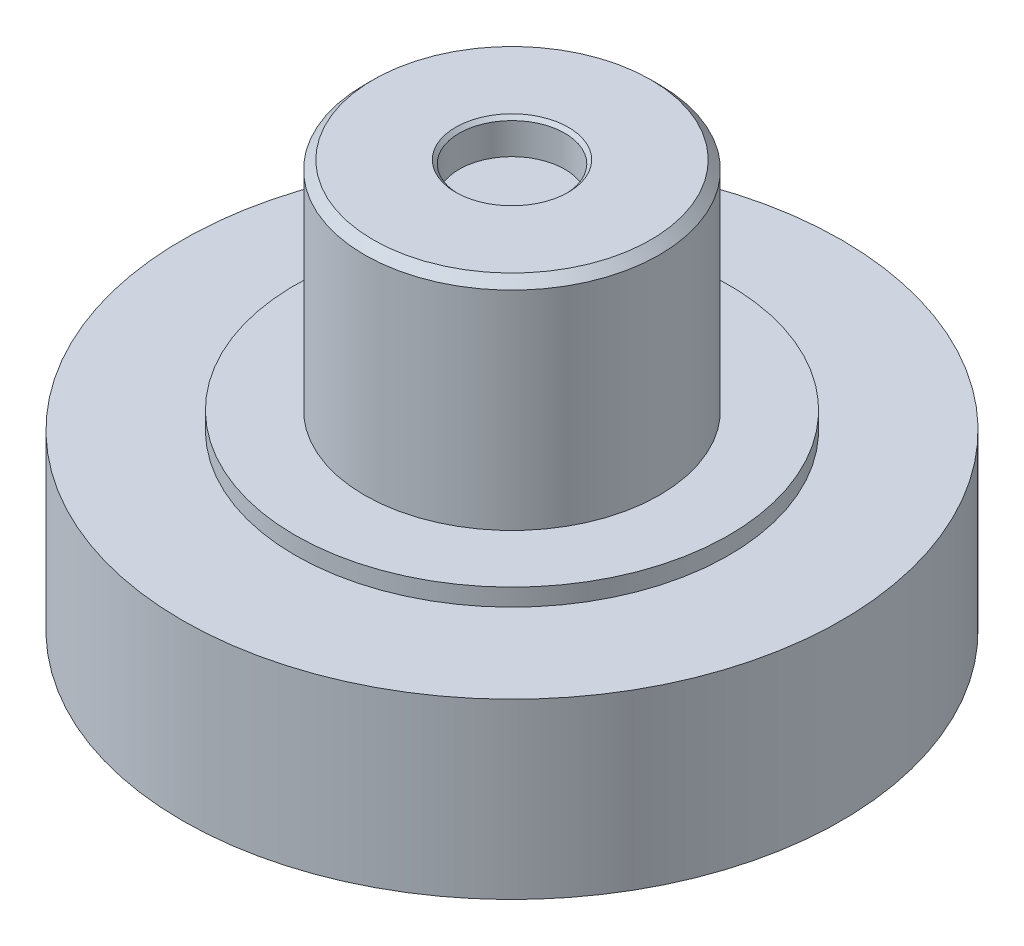
ISO-10303-21;
HEADER;
FILE_DESCRIPTION(('STEP AP214'),'2;1');
FILE_NAME('part.step','',(''),(''),'','','');
FILE_SCHEMA(('AUTOMOTIVE_DESIGN { 1 0 10303 214 1 1 1 1 }'));
ENDSEC;
DATA;
#1=APPLICATION_CONTEXT('core data for automotive mechanical design processes');
#2=APPLICATION_PROTOCOL_DEFINITION('international standard','automotive_design',2000,#1);
#3=PRODUCT_CONTEXT('',#1,'mechanical');
#4=PRODUCT('Part','Part','',(#3));
#5=PRODUCT_RELATED_PRODUCT_CATEGORY('part','',(#4));
#6=PRODUCT_DEFINITION_FORMATION('','',#4);
#7=PRODUCT_DEFINITION_CONTEXT('part definition',#1,'design');
#8=PRODUCT_DEFINITION('design','',#6,#7);
#9=PRODUCT_DEFINITION_SHAPE('','',#8);
#10=(LENGTH_UNIT() NAMED_UNIT(*) SI_UNIT(.MILLI.,.METRE.));
#11=(NAMED_UNIT(*) PLANE_ANGLE_UNIT() SI_UNIT($,.RADIAN.));
#12=(NAMED_UNIT(*) SI_UNIT($,.STERADIAN.) SOLID_ANGLE_UNIT());
#13=UNCERTAINTY_MEASURE_WITH_UNIT(LENGTH_MEASURE(1.E-05),#10,'distance_accuracy_value','');
#14=(GEOMETRIC_REPRESENTATION_CONTEXT(3) GLOBAL_UNCERTAINTY_ASSIGNED_CONTEXT((#13)) GLOBAL_UNIT_ASSIGNED_CONTEXT((#10,
#11,#12)) REPRESENTATION_CONTEXT('',''));
#15=CARTESIAN_POINT('',(0.,0.,0.));
#16=DIRECTION('',(0.,0.,1.));
#17=DIRECTION('',(1.,0.,0.));
#18=AXIS2_PLACEMENT_3D('',#15,#16,#17);
#19=CARTESIAN_POINT('',(0.,10.,0.));
#20=DIRECTION('',(0.,-1.,0.));
#21=DIRECTION('',(0.,0.,-1.));
#22=AXIS2_PLACEMENT_3D('',#19,#20,#21);
#23=CYLINDRICAL_SURFACE('',#22,19.);
#24=CARTESIAN_POINT('',(0.,10.,0.));
#25=DIRECTION('',(0.,1.,0.));
#26=DIRECTION('',(0.,0.,1.));
#27=AXIS2_PLACEMENT_3D('',#24,#25,#26);
#28=CIRCLE('',#27,19.);
#29=CARTESIAN_POINT('',(0.,10.,19.));
#30=VERTEX_POINT('',#29);
#31=EDGE_CURVE('E72',#30,#30,#28,.T.);
#32=ORIENTED_EDGE('',*,*,#31,.F.);
#33=EDGE_LOOP('',(#32));
#34=FACE_BOUND('',#33,.T.);
#35=CARTESIAN_POINT('',(0.,0.,0.));
#36=DIRECTION('',(0.,1.,0.));
#37=DIRECTION('',(0.,0.,1.));
#38=AXIS2_PLACEMENT_3D('',#35,#36,#37);
#39=CIRCLE('',#38,19.);
#40=CARTESIAN_POINT('',(0.,0.,19.));
#41=VERTEX_POINT('',#40);
#42=EDGE_CURVE('E69',#41,#41,#39,.T.);
#43=ORIENTED_EDGE('',*,*,#42,.T.);
#44=EDGE_LOOP('',(#43));
#45=FACE_BOUND('',#44,.T.);
#46=ADVANCED_FACE('F35',(#34,#45),#23,.T.);
#47=CARTESIAN_POINT('',(0.,10.,0.));
#48=DIRECTION('',(0.,1.,0.));
#49=DIRECTION('',(0.,0.,1.));
#50=AXIS2_PLACEMENT_3D('',#47,#48,#49);
#51=PLANE('',#50);
#52=CARTESIAN_POINT('',(0.,10.,0.));
#53=DIRECTION('',(0.,1.,0.));
#54=DIRECTION('',(0.,0.,1.));
#55=AXIS2_PLACEMENT_3D('',#52,#53,#54);
#56=CIRCLE('',#55,12.5);
#57=CARTESIAN_POINT('',(0.,10.,12.5));
#58=VERTEX_POINT('',#57);
#59=EDGE_CURVE('E76',#58,#58,#56,.T.);
#60=ORIENTED_EDGE('',*,*,#59,.F.);
#61=EDGE_LOOP('',(#60));
#62=FACE_BOUND('',#61,.T.);
#63=ORIENTED_EDGE('',*,*,#31,.T.);
#64=EDGE_LOOP('',(#63));
#65=FACE_BOUND('',#64,.T.);
#66=ADVANCED_FACE('F102',(#62,#65),#51,.T.);
#67=CARTESIAN_POINT('',(0.,0.,0.));
#68=DIRECTION('',(0.,1.,0.));
#69=DIRECTION('',(0.,0.,1.));
#70=AXIS2_PLACEMENT_3D('',#67,#68,#69);
#71=PLANE('',#70);
#72=CARTESIAN_POINT('',(0.,0.,11.5));
#73=DIRECTION('',(0.,1.,0.));
#74=DIRECTION('',(0.,0.,1.));
#75=AXIS2_PLACEMENT_3D('',#72,#73,#74);
#76=CIRCLE('',#75,5.58137084989848);
#77=CARTESIAN_POINT('',(0.,0.,17.0813708498985));
#78=VERTEX_POINT('',#77);
#79=EDGE_CURVE('E59',#78,#78,#76,.T.);
#80=ORIENTED_EDGE('',*,*,#79,.T.);
#81=EDGE_LOOP('',(#80));
#82=FACE_BOUND('',#81,.T.);
#83=ORIENTED_EDGE('',*,*,#42,.F.);
#84=EDGE_LOOP('',(#83));
#85=FACE_BOUND('',#84,.T.);
#86=ADVANCED_FACE('F108',(#82,#85),#71,.F.);
#87=CARTESIAN_POINT('',(0.,11.,0.));
#88=DIRECTION('',(0.,-1.,0.));
#89=DIRECTION('',(0.,0.,-1.));
#90=AXIS2_PLACEMENT_3D('',#87,#88,#89);
#91=CYLINDRICAL_SURFACE('',#90,12.5);
#92=CARTESIAN_POINT('',(0.,11.,0.));
#93=DIRECTION('',(0.,1.,0.));
#94=DIRECTION('',(0.,0.,1.));
#95=AXIS2_PLACEMENT_3D('',#92,#93,#94);
#96=CIRCLE('',#95,12.5);
#97=CARTESIAN_POINT('',(0.,11.,12.5));
#98=VERTEX_POINT('',#97);
#99=EDGE_CURVE('E73',#98,#98,#96,.T.);
#100=ORIENTED_EDGE('',*,*,#99,.F.);
#101=EDGE_LOOP('',(#100));
#102=FACE_BOUND('',#101,.T.);
#103=ORIENTED_EDGE('',*,*,#59,.T.);
#104=EDGE_LOOP('',(#103));
#105=FACE_BOUND('',#104,.T.);
#106=ADVANCED_FACE('F146',(#102,#105),#91,.T.);
#107=CARTESIAN_POINT('',(0.,11.,0.));
#108=DIRECTION('',(0.,1.,0.));
#109=DIRECTION('',(0.,0.,1.));
#110=AXIS2_PLACEMENT_3D('',#107,#108,#109);
#111=PLANE('',#110);
#112=CARTESIAN_POINT('',(0.,11.,0.));
#113=DIRECTION('',(0.,1.,0.));
#114=DIRECTION('',(0.,0.,1.));
#115=AXIS2_PLACEMENT_3D('',#112,#113,#114);
#116=CIRCLE('',#115,8.5);
#117=CARTESIAN_POINT('',(0.,11.,8.5));
#118=VERTEX_POINT('',#117);
#119=EDGE_CURVE('E68',#118,#118,#116,.T.);
#120=ORIENTED_EDGE('',*,*,#119,.F.);
#121=EDGE_LOOP('',(#120));
#122=FACE_BOUND('',#121,.T.);
#123=ORIENTED_EDGE('',*,*,#99,.T.);
#124=EDGE_LOOP('',(#123));
#125=FACE_BOUND('',#124,.T.);
#126=ADVANCED_FACE('F140',(#122,#125),#111,.T.);
#127=CARTESIAN_POINT('',(0.,23.5,0.));
#128=DIRECTION('',(0.,-1.,0.));
#129=DIRECTION('',(0.,0.,-1.));
#130=AXIS2_PLACEMENT_3D('',#127,#128,#129);
#131=CYLINDRICAL_SURFACE('',#130,8.5);
#132=CARTESIAN_POINT('',(0.,23.,0.));
#133=DIRECTION('',(0.,1.,0.));
#134=DIRECTION('',(0.,0.,1.));
#135=AXIS2_PLACEMENT_3D('',#132,#133,#134);
#136=CIRCLE('',#135,8.5);
#137=CARTESIAN_POINT('',(0.,23.,8.5));
#138=VERTEX_POINT('',#137);
#139=EDGE_CURVE('E47',#138,#138,#136,.F.);
#140=ORIENTED_EDGE('',*,*,#139,.T.);
#141=EDGE_LOOP('',(#140));
#142=FACE_BOUND('',#141,.T.);
#143=ORIENTED_EDGE('',*,*,#119,.T.);
#144=EDGE_LOOP('',(#143));
#145=FACE_BOUND('',#144,.T.);
#146=ADVANCED_FACE('F99',(#142,#145),#131,.T.);
#147=CARTESIAN_POINT('',(0.,23.5,0.));
#148=DIRECTION('',(0.,1.,0.));
#149=DIRECTION('',(0.,0.,1.));
#150=AXIS2_PLACEMENT_3D('',#147,#148,#149);
#151=PLANE('',#150);
#152=CARTESIAN_POINT('',(0.,23.5,0.));
#153=DIRECTION('',(0.,1.,0.));
#154=DIRECTION('',(0.,0.,1.));
#155=AXIS2_PLACEMENT_3D('',#152,#153,#154);
#156=CIRCLE('',#155,3.25);
#157=CARTESIAN_POINT('',(0.,23.5,3.25));
#158=VERTEX_POINT('',#157);
#159=EDGE_CURVE('E10',#158,#158,#156,.F.);
#160=ORIENTED_EDGE('',*,*,#159,.T.);
#161=EDGE_LOOP('',(#160));
#162=FACE_BOUND('',#161,.T.);
#163=CARTESIAN_POINT('',(0.,23.5,0.));
#164=DIRECTION('',(0.,1.,0.));
#165=DIRECTION('',(0.,0.,1.));
#166=AXIS2_PLACEMENT_3D('',#163,#164,#165);
#167=CIRCLE('',#166,8.00000000000001);
#168=CARTESIAN_POINT('',(0.,23.5,8.00000000000001));
#169=VERTEX_POINT('',#168);
#170=EDGE_CURVE('E51',#169,#169,#167,.T.);
#171=ORIENTED_EDGE('',*,*,#170,.T.);
#172=EDGE_LOOP('',(#171));
#173=FACE_BOUND('',#172,.T.);
#174=ADVANCED_FACE('F91',(#162,#173),#151,.T.);
#175=CARTESIAN_POINT('',(0.,21.5,0.));
#176=DIRECTION('',(0.,1.,0.));
#177=DIRECTION('',(0.,0.,1.));
#178=AXIS2_PLACEMENT_3D('',#175,#176,#177);
#179=CYLINDRICAL_SURFACE('',#178,3.05);
#180=CARTESIAN_POINT('',(0.,23.3,0.));
#181=DIRECTION('',(0.,1.,0.));
#182=DIRECTION('',(0.,0.,1.));
#183=AXIS2_PLACEMENT_3D('',#180,#181,#182);
#184=CIRCLE('',#183,3.05);
#185=CARTESIAN_POINT('',(0.,23.3,3.05));
#186=VERTEX_POINT('',#185);
#187=EDGE_CURVE('E43',#186,#186,#184,.T.);
#188=ORIENTED_EDGE('',*,*,#187,.T.);
#189=EDGE_LOOP('',(#188));
#190=FACE_BOUND('',#189,.T.);
#191=CARTESIAN_POINT('',(0.,21.5,0.));
#192=DIRECTION('',(0.,1.,0.));
#193=DIRECTION('',(0.,0.,1.));
#194=AXIS2_PLACEMENT_3D('',#191,#192,#193);
#195=CIRCLE('',#194,3.05);
#196=CARTESIAN_POINT('',(0.,21.5,3.05));
#197=VERTEX_POINT('',#196);
#198=EDGE_CURVE('E81',#197,#197,#195,.T.);
#199=ORIENTED_EDGE('',*,*,#198,.F.);
#200=EDGE_LOOP('',(#199));
#201=FACE_BOUND('',#200,.T.);
#202=ADVANCED_FACE('F89',(#190,#201),#179,.F.);
#203=CARTESIAN_POINT('',(0.,21.5,0.));
#204=DIRECTION('',(0.,1.,0.));
#205=DIRECTION('',(0.,0.,1.));
#206=AXIS2_PLACEMENT_3D('',#203,#204,#205);
#207=PLANE('',#206);
#208=ORIENTED_EDGE('',*,*,#198,.T.);
#209=EDGE_LOOP('',(#208));
#210=FACE_BOUND('',#209,.T.);
#211=ADVANCED_FACE('F87',(#210),#207,.T.);
#212=CARTESIAN_POINT('',(0.,0.,11.5));
#213=DIRECTION('',(0.,-1.,0.));
#214=DIRECTION('',(0.,0.,-1.));
#215=AXIS2_PLACEMENT_3D('',#212,#213,#214);
#216=CONICAL_SURFACE('',#215,5.25,0.78539816339745);
#217=CARTESIAN_POINT('',(0.,0.23431457505076,11.5));
#218=DIRECTION('',(0.,1.,0.));
#219=DIRECTION('',(0.,0.,1.));
#220=AXIS2_PLACEMENT_3D('',#217,#218,#219);
#221=CIRCLE('',#220,5.01568542494924);
#222=CARTESIAN_POINT('',(0.,0.23431457505076,16.5156854249492));
#223=VERTEX_POINT('',#222);
#224=EDGE_CURVE('E62',#223,#223,#221,.F.);
#225=ORIENTED_EDGE('',*,*,#224,.T.);
#226=EDGE_LOOP('',(#225));
#227=FACE_BOUND('',#226,.T.);
#228=CARTESIAN_POINT('',(0.,0.265685424949238,11.5));
#229=DIRECTION('',(0.,1.,0.));
#230=DIRECTION('',(0.,0.,1.));
#231=AXIS2_PLACEMENT_3D('',#228,#229,#230);
#232=CIRCLE('',#231,4.98431457505076);
#233=CARTESIAN_POINT('',(0.,0.265685424949238,16.4843145750508));
#234=VERTEX_POINT('',#233);
#235=EDGE_CURVE('E65',#234,#234,#232,.T.);
#236=ORIENTED_EDGE('',*,*,#235,.T.);
#237=EDGE_LOOP('',(#236));
#238=FACE_BOUND('',#237,.T.);
#239=ADVANCED_FACE('F97',(#227,#238),#216,.F.);
#240=CARTESIAN_POINT('',(0.,0.5,11.5));
#241=DIRECTION('',(0.,-1.,0.));
#242=DIRECTION('',(0.,0.,-1.));
#243=AXIS2_PLACEMENT_3D('',#240,#241,#242);
#244=PLANE('',#243);
#245=CARTESIAN_POINT('',(0.,0.5,11.5));
#246=DIRECTION('',(0.,-1.,0.));
#247=DIRECTION('',(0.,0.,-1.));
#248=AXIS2_PLACEMENT_3D('',#245,#246,#247);
#249=CIRCLE('',#248,4.41862915010152);
#250=CARTESIAN_POINT('',(0.,0.5,7.08137084989848));
#251=VERTEX_POINT('',#250);
#252=EDGE_CURVE('E56',#251,#251,#249,.T.);
#253=ORIENTED_EDGE('',*,*,#252,.T.);
#254=EDGE_LOOP('',(#253));
#255=FACE_BOUND('',#254,.T.);
#256=ADVANCED_FACE('F119',(#255),#244,.T.);
#257=CARTESIAN_POINT('',(0.,0.8,11.5));
#258=DIRECTION('',(0.,1.,0.));
#259=DIRECTION('',(0.,0.,1.));
#260=AXIS2_PLACEMENT_3D('',#257,#258,#259);
#261=TOROIDAL_SURFACE('',#260,5.58137084989848,0.8);
#262=ORIENTED_EDGE('',*,*,#79,.F.);
#263=EDGE_LOOP('',(#262));
#264=FACE_BOUND('',#263,.T.);
#265=ORIENTED_EDGE('',*,*,#224,.F.);
#266=EDGE_LOOP('',(#265));
#267=FACE_BOUND('',#266,.T.);
#268=ADVANCED_FACE('F115',(#264,#267),#261,.T.);
#269=CARTESIAN_POINT('',(0.,-0.3,11.5));
#270=DIRECTION('',(0.,-1.,0.));
#271=DIRECTION('',(0.,0.,-1.));
#272=AXIS2_PLACEMENT_3D('',#269,#270,#271);
#273=TOROIDAL_SURFACE('',#272,4.41862915010152,0.8);
#274=ORIENTED_EDGE('',*,*,#235,.F.);
#275=EDGE_LOOP('',(#274));
#276=FACE_BOUND('',#275,.T.);
#277=ORIENTED_EDGE('',*,*,#252,.F.);
#278=EDGE_LOOP('',(#277));
#279=FACE_BOUND('',#278,.T.);
#280=ADVANCED_FACE('F118',(#276,#279),#273,.F.);
#281=CARTESIAN_POINT('',(0.,23.5,0.));
#282=DIRECTION('',(0.,-1.,0.));
#283=DIRECTION('',(0.,0.,-1.));
#284=AXIS2_PLACEMENT_3D('',#281,#282,#283);
#285=CONICAL_SURFACE('',#284,8.00000000000001,0.785398163397448);
#286=ORIENTED_EDGE('',*,*,#139,.F.);
#287=EDGE_LOOP('',(#286));
#288=FACE_BOUND('',#287,.T.);
#289=ORIENTED_EDGE('',*,*,#170,.F.);
#290=EDGE_LOOP('',(#289));
#291=FACE_BOUND('',#290,.T.);
#292=ADVANCED_FACE('F122',(#288,#291),#285,.T.);
#293=CARTESIAN_POINT('',(0.,23.3,0.));
#294=DIRECTION('',(0.,1.,0.));
#295=DIRECTION('',(0.,0.,1.));
#296=AXIS2_PLACEMENT_3D('',#293,#294,#295);
#297=CONICAL_SURFACE('',#296,3.05,0.785398163397442);
#298=ORIENTED_EDGE('',*,*,#159,.F.);
#299=EDGE_LOOP('',(#298));
#300=FACE_BOUND('',#299,.T.);
#301=ORIENTED_EDGE('',*,*,#187,.F.);
#302=EDGE_LOOP('',(#301));
#303=FACE_BOUND('',#302,.T.);
#304=ADVANCED_FACE('F38',(#300,#303),#297,.F.);
#305=CLOSED_SHELL('',(#46,#66,#86,#106,#126,#146,#174,#202,#211,#239,#256,#268,#280,#292,#304));
#306=MANIFOLD_SOLID_BREP('B2',#305);
#307=ADVANCED_BREP_SHAPE_REPRESENTATION('',(#18,#306),#14);
#308=SHAPE_DEFINITION_REPRESENTATION(#9,#307);
ENDSEC;
END-ISO-10303-21;
